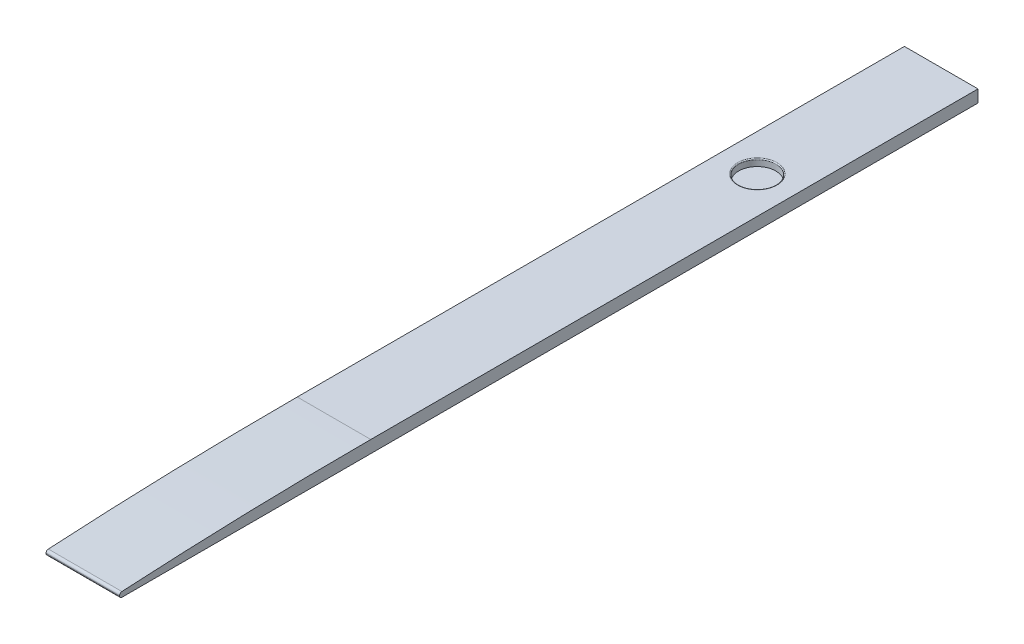
ISO-10303-21;
HEADER;
FILE_DESCRIPTION(('STEP AP214'),'2;1');
FILE_NAME('part.step','',(''),(''),'','','');
FILE_SCHEMA(('AUTOMOTIVE_DESIGN { 1 0 10303 214 1 1 1 1 }'));
ENDSEC;
DATA;
#1=APPLICATION_CONTEXT('core data for automotive mechanical design processes');
#2=APPLICATION_PROTOCOL_DEFINITION('international standard','automotive_design',2000,#1);
#3=PRODUCT_CONTEXT('',#1,'mechanical');
#4=PRODUCT('Part','Part','',(#3));
#5=PRODUCT_RELATED_PRODUCT_CATEGORY('part','',(#4));
#6=PRODUCT_DEFINITION_FORMATION('','',#4);
#7=PRODUCT_DEFINITION_CONTEXT('part definition',#1,'design');
#8=PRODUCT_DEFINITION('design','',#6,#7);
#9=PRODUCT_DEFINITION_SHAPE('','',#8);
#10=(LENGTH_UNIT() NAMED_UNIT(*) SI_UNIT(.MILLI.,.METRE.));
#11=(NAMED_UNIT(*) PLANE_ANGLE_UNIT() SI_UNIT($,.RADIAN.));
#12=(NAMED_UNIT(*) SI_UNIT($,.STERADIAN.) SOLID_ANGLE_UNIT());
#13=UNCERTAINTY_MEASURE_WITH_UNIT(LENGTH_MEASURE(1.E-05),#10,'distance_accuracy_value','');
#14=(GEOMETRIC_REPRESENTATION_CONTEXT(3) GLOBAL_UNCERTAINTY_ASSIGNED_CONTEXT((#13)) GLOBAL_UNIT_ASSIGNED_CONTEXT((#10,
#11,#12)) REPRESENTATION_CONTEXT('',''));
#15=CARTESIAN_POINT('',(0.,0.,0.));
#16=DIRECTION('',(0.,0.,1.));
#17=DIRECTION('',(1.,0.,0.));
#18=AXIS2_PLACEMENT_3D('',#15,#16,#17);
#19=CARTESIAN_POINT('',(30.,5.,0.));
#20=DIRECTION('',(0.,0.,1.));
#21=DIRECTION('',(0.,-1.,0.));
#22=AXIS2_PLACEMENT_3D('',#19,#20,#21);
#23=PLANE('',#22);
#24=DIRECTION('',(-1.,0.,0.));
#25=VECTOR('',#24,1.);
#26=CARTESIAN_POINT('',(25.,1.5,0.));
#27=LINE('',#26,#25);
#28=CARTESIAN_POINT('',(25.,1.5,0.));
#29=VERTEX_POINT('',#28);
#30=CARTESIAN_POINT('',(5.,1.5,0.));
#31=VERTEX_POINT('',#30);
#32=EDGE_CURVE('E157',#29,#31,#27,.T.);
#33=ORIENTED_EDGE('',*,*,#32,.F.);
#34=DIRECTION('',(0.,-1.,0.));
#35=VECTOR('',#34,1.);
#36=CARTESIAN_POINT('',(25.,3.5,0.));
#37=LINE('',#36,#35);
#38=CARTESIAN_POINT('',(25.,3.5,0.));
#39=VERTEX_POINT('',#38);
#40=EDGE_CURVE('E131',#39,#29,#37,.T.);
#41=ORIENTED_EDGE('',*,*,#40,.F.);
#42=DIRECTION('',(1.,0.,0.));
#43=VECTOR('',#42,1.);
#44=CARTESIAN_POINT('',(25.,3.5,0.));
#45=LINE('',#44,#43);
#46=CARTESIAN_POINT('',(5.,3.5,0.));
#47=VERTEX_POINT('',#46);
#48=EDGE_CURVE('E148',#47,#39,#45,.T.);
#49=ORIENTED_EDGE('',*,*,#48,.F.);
#50=DIRECTION('',(0.,1.,0.));
#51=VECTOR('',#50,1.);
#52=CARTESIAN_POINT('',(5.,3.5,0.));
#53=LINE('',#52,#51);
#54=EDGE_CURVE('E151',#31,#47,#53,.T.);
#55=ORIENTED_EDGE('',*,*,#54,.F.);
#56=EDGE_LOOP('',(#33,#41,#49,#55));
#57=FACE_BOUND('',#56,.T.);
#58=DIRECTION('',(0.,1.,0.));
#59=VECTOR('',#58,1.);
#60=CARTESIAN_POINT('',(0.,5.,0.));
#61=LINE('',#60,#59);
#62=CARTESIAN_POINT('',(0.,0.,0.));
#63=VERTEX_POINT('',#62);
#64=CARTESIAN_POINT('',(0.,5.,0.));
#65=VERTEX_POINT('',#64);
#66=EDGE_CURVE('E169',#63,#65,#61,.T.);
#67=ORIENTED_EDGE('',*,*,#66,.T.);
#68=DIRECTION('',(-1.,0.,0.));
#69=VECTOR('',#68,1.);
#70=CARTESIAN_POINT('',(30.,5.,0.));
#71=LINE('',#70,#69);
#72=CARTESIAN_POINT('',(30.,5.,0.));
#73=VERTEX_POINT('',#72);
#74=EDGE_CURVE('E192',#73,#65,#71,.T.);
#75=ORIENTED_EDGE('',*,*,#74,.F.);
#76=DIRECTION('',(0.,1.,0.));
#77=VECTOR('',#76,1.);
#78=CARTESIAN_POINT('',(30.,5.,0.));
#79=LINE('',#78,#77);
#80=CARTESIAN_POINT('',(30.,0.,0.));
#81=VERTEX_POINT('',#80);
#82=EDGE_CURVE('E170',#81,#73,#79,.T.);
#83=ORIENTED_EDGE('',*,*,#82,.F.);
#84=DIRECTION('',(-1.,0.,0.));
#85=VECTOR('',#84,1.);
#86=CARTESIAN_POINT('',(30.,0.,0.));
#87=LINE('',#86,#85);
#88=EDGE_CURVE('E181',#81,#63,#87,.T.);
#89=ORIENTED_EDGE('',*,*,#88,.T.);
#90=EDGE_LOOP('',(#67,#75,#83,#89));
#91=FACE_BOUND('',#90,.T.);
#92=ADVANCED_FACE('F39',(#57,#91),#23,.F.);
#93=CARTESIAN_POINT('',(30.,5.,300.));
#94=DIRECTION('',(0.,-1.,0.));
#95=DIRECTION('',(0.,0.,-1.));
#96=AXIS2_PLACEMENT_3D('',#93,#94,#95);
#97=PLANE('',#96);
#98=CARTESIAN_POINT('',(15.,5.,75.));
#99=DIRECTION('',(0.,-1.,0.));
#100=DIRECTION('',(0.,0.,-1.));
#101=AXIS2_PLACEMENT_3D('',#98,#99,#100);
#102=CIRCLE('',#101,8.);
#103=CARTESIAN_POINT('',(15.,5.,67.));
#104=VERTEX_POINT('',#103);
#105=EDGE_CURVE('E204',#104,#104,#102,.T.);
#106=ORIENTED_EDGE('',*,*,#105,.T.);
#107=EDGE_LOOP('',(#106));
#108=FACE_BOUND('',#107,.T.);
#109=DIRECTION('',(0.,0.,1.));
#110=VECTOR('',#109,1.);
#111=CARTESIAN_POINT('',(0.,5.,300.));
#112=LINE('',#111,#110);
#113=CARTESIAN_POINT('',(0.,5.,247.574417258189));
#114=VERTEX_POINT('',#113);
#115=EDGE_CURVE('E184',#65,#114,#112,.T.);
#116=ORIENTED_EDGE('',*,*,#115,.T.);
#117=DIRECTION('',(1.,0.,0.));
#118=VECTOR('',#117,1.);
#119=CARTESIAN_POINT('',(30.,5.,247.574417258189));
#120=LINE('',#119,#118);
#121=CARTESIAN_POINT('',(30.,4.99999999999989,247.574417258189));
#122=VERTEX_POINT('',#121);
#123=EDGE_CURVE('E197',#114,#122,#120,.T.);
#124=ORIENTED_EDGE('',*,*,#123,.T.);
#125=DIRECTION('',(0.,0.,1.));
#126=VECTOR('',#125,1.);
#127=CARTESIAN_POINT('',(30.,5.,300.));
#128=LINE('',#127,#126);
#129=EDGE_CURVE('E173',#73,#122,#128,.T.);
#130=ORIENTED_EDGE('',*,*,#129,.F.);
#131=ORIENTED_EDGE('',*,*,#74,.T.);
#132=EDGE_LOOP('',(#116,#124,#130,#131));
#133=FACE_BOUND('',#132,.T.);
#134=ADVANCED_FACE('F242',(#108,#133),#97,.F.);
#135=CARTESIAN_POINT('',(30.,0.,350.));
#136=DIRECTION('',(0.,0.,-1.));
#137=DIRECTION('',(-1.,0.,0.));
#138=AXIS2_PLACEMENT_3D('',#135,#136,#137);
#139=PLANE('',#138);
#140=DIRECTION('',(0.,-1.,0.));
#141=VECTOR('',#140,1.);
#142=CARTESIAN_POINT('',(0.,0.,350.));
#143=LINE('',#142,#141);
#144=CARTESIAN_POINT('',(0.,1.05665749009543,350.));
#145=VERTEX_POINT('',#144);
#146=CARTESIAN_POINT('',(0.,0.999999999999957,350.));
#147=VERTEX_POINT('',#146);
#148=EDGE_CURVE('E187',#145,#147,#143,.T.);
#149=ORIENTED_EDGE('',*,*,#148,.T.);
#150=DIRECTION('',(-1.,0.,0.));
#151=VECTOR('',#150,1.);
#152=CARTESIAN_POINT('',(30.,0.999999999999957,350.));
#153=LINE('',#152,#151);
#154=CARTESIAN_POINT('',(30.,0.999999999999957,350.));
#155=VERTEX_POINT('',#154);
#156=EDGE_CURVE('E60',#147,#155,#153,.F.);
#157=ORIENTED_EDGE('',*,*,#156,.T.);
#158=DIRECTION('',(0.,-1.,0.));
#159=VECTOR('',#158,1.);
#160=CARTESIAN_POINT('',(30.,0.,350.));
#161=LINE('',#160,#159);
#162=CARTESIAN_POINT('',(30.,1.05665749009543,350.));
#163=VERTEX_POINT('',#162);
#164=EDGE_CURVE('E177',#163,#155,#161,.T.);
#165=ORIENTED_EDGE('',*,*,#164,.F.);
#166=DIRECTION('',(-1.,0.,0.));
#167=VECTOR('',#166,1.);
#168=CARTESIAN_POINT('',(0.,1.05665749009543,350.));
#169=LINE('',#168,#167);
#170=EDGE_CURVE('E214',#163,#145,#169,.T.);
#171=ORIENTED_EDGE('',*,*,#170,.T.);
#172=EDGE_LOOP('',(#149,#157,#165,#171));
#173=FACE_BOUND('',#172,.T.);
#174=ADVANCED_FACE('F235',(#173),#139,.F.);
#175=CARTESIAN_POINT('',(30.,0.,0.));
#176=DIRECTION('',(0.,1.,0.));
#177=DIRECTION('',(0.,0.,1.));
#178=AXIS2_PLACEMENT_3D('',#175,#176,#177);
#179=PLANE('',#178);
#180=DIRECTION('',(0.,0.,-1.));
#181=VECTOR('',#180,1.);
#182=CARTESIAN_POINT('',(30.,0.,0.));
#183=LINE('',#182,#181);
#184=CARTESIAN_POINT('',(30.,0.,349.));
#185=VERTEX_POINT('',#184);
#186=EDGE_CURVE('E179',#185,#81,#183,.T.);
#187=ORIENTED_EDGE('',*,*,#186,.F.);
#188=DIRECTION('',(-1.,0.,0.));
#189=VECTOR('',#188,1.);
#190=CARTESIAN_POINT('',(30.,0.,349.));
#191=LINE('',#190,#189);
#192=CARTESIAN_POINT('',(0.,0.,349.));
#193=VERTEX_POINT('',#192);
#194=EDGE_CURVE('E207',#185,#193,#191,.T.);
#195=ORIENTED_EDGE('',*,*,#194,.T.);
#196=DIRECTION('',(0.,0.,-1.));
#197=VECTOR('',#196,1.);
#198=CARTESIAN_POINT('',(0.,0.,0.));
#199=LINE('',#198,#197);
#200=EDGE_CURVE('E174',#193,#63,#199,.T.);
#201=ORIENTED_EDGE('',*,*,#200,.T.);
#202=ORIENTED_EDGE('',*,*,#88,.F.);
#203=EDGE_LOOP('',(#187,#195,#201,#202));
#204=FACE_BOUND('',#203,.T.);
#205=ADVANCED_FACE('F227',(#204),#179,.F.);
#206=CARTESIAN_POINT('',(30.,0.,0.));
#207=DIRECTION('',(-1.,0.,0.));
#208=DIRECTION('',(0.,0.,1.));
#209=AXIS2_PLACEMENT_3D('',#206,#207,#208);
#210=PLANE('',#209);
#211=ORIENTED_EDGE('',*,*,#164,.T.);
#212=CARTESIAN_POINT('',(30.,0.999999999999957,349.));
#213=DIRECTION('',(-1.,0.,0.));
#214=DIRECTION('',(0.,0.,1.));
#215=AXIS2_PLACEMENT_3D('',#212,#213,#214);
#216=CIRCLE('',#215,1.);
#217=EDGE_CURVE('E47',#155,#185,#216,.F.);
#218=ORIENTED_EDGE('',*,*,#217,.T.);
#219=ORIENTED_EDGE('',*,*,#186,.T.);
#220=ORIENTED_EDGE('',*,*,#82,.T.);
#221=ORIENTED_EDGE('',*,*,#129,.T.);
#222=CARTESIAN_POINT('',(30.,-1745.,247.574417258189));
#223=DIRECTION('',(-1.,0.,0.));
#224=DIRECTION('',(0.,0.,1.));
#225=AXIS2_PLACEMENT_3D('',#222,#223,#224);
#226=CIRCLE('',#225,1750.);
#227=CARTESIAN_POINT('',(30.,2.05497461844861,349.057990613346));
#228=VERTEX_POINT('',#227);
#229=EDGE_CURVE('E199',#122,#228,#226,.F.);
#230=ORIENTED_EDGE('',*,*,#229,.T.);
#231=CARTESIAN_POINT('',(30.,1.05665749009543,349.));
#232=DIRECTION('',(-1.,0.,0.));
#233=DIRECTION('',(0.,0.,1.));
#234=AXIS2_PLACEMENT_3D('',#231,#232,#233);
#235=CIRCLE('',#234,1.);
#236=EDGE_CURVE('E218',#228,#163,#235,.F.);
#237=ORIENTED_EDGE('',*,*,#236,.T.);
#238=EDGE_LOOP('',(#211,#218,#219,#220,#221,#230,#237));
#239=FACE_BOUND('',#238,.T.);
#240=ADVANCED_FACE('F222',(#239),#210,.F.);
#241=CARTESIAN_POINT('',(0.,0.,0.));
#242=DIRECTION('',(-1.,0.,0.));
#243=DIRECTION('',(0.,0.,1.));
#244=AXIS2_PLACEMENT_3D('',#241,#242,#243);
#245=PLANE('',#244);
#246=ORIENTED_EDGE('',*,*,#200,.F.);
#247=CARTESIAN_POINT('',(0.,0.999999999999957,349.));
#248=DIRECTION('',(-1.,0.,0.));
#249=DIRECTION('',(0.,0.,1.));
#250=AXIS2_PLACEMENT_3D('',#247,#248,#249);
#251=CIRCLE('',#250,1.);
#252=EDGE_CURVE('E212',#193,#147,#251,.T.);
#253=ORIENTED_EDGE('',*,*,#252,.T.);
#254=ORIENTED_EDGE('',*,*,#148,.F.);
#255=CARTESIAN_POINT('',(0.,1.05665749009543,349.));
#256=DIRECTION('',(-1.,0.,0.));
#257=DIRECTION('',(0.,0.,1.));
#258=AXIS2_PLACEMENT_3D('',#255,#256,#257);
#259=CIRCLE('',#258,1.);
#260=CARTESIAN_POINT('',(0.,2.05497461844861,349.057990613346));
#261=VERTEX_POINT('',#260);
#262=EDGE_CURVE('E210',#145,#261,#259,.T.);
#263=ORIENTED_EDGE('',*,*,#262,.T.);
#264=CARTESIAN_POINT('',(0.,-1745.,247.574417258189));
#265=DIRECTION('',(-1.,0.,0.));
#266=DIRECTION('',(0.,0.,1.));
#267=AXIS2_PLACEMENT_3D('',#264,#265,#266);
#268=CIRCLE('',#267,1750.);
#269=EDGE_CURVE('E195',#261,#114,#268,.T.);
#270=ORIENTED_EDGE('',*,*,#269,.T.);
#271=ORIENTED_EDGE('',*,*,#115,.F.);
#272=ORIENTED_EDGE('',*,*,#66,.F.);
#273=EDGE_LOOP('',(#246,#253,#254,#263,#270,#271,#272));
#274=FACE_BOUND('',#273,.T.);
#275=ADVANCED_FACE('F233',(#274),#245,.T.);
#276=CARTESIAN_POINT('',(30.,-1745.,247.574417258189));
#277=DIRECTION('',(1.,0.,0.));
#278=DIRECTION('',(0.,0.,-1.));
#279=AXIS2_PLACEMENT_3D('',#276,#277,#278);
#280=CYLINDRICAL_SURFACE('',#279,1750.);
#281=ORIENTED_EDGE('',*,*,#269,.F.);
#282=DIRECTION('',(1.,0.,0.));
#283=VECTOR('',#282,1.);
#284=CARTESIAN_POINT('',(30.,2.05497461844883,349.057990613346));
#285=LINE('',#284,#283);
#286=EDGE_CURVE('E11',#261,#228,#285,.T.);
#287=ORIENTED_EDGE('',*,*,#286,.T.);
#288=ORIENTED_EDGE('',*,*,#229,.F.);
#289=ORIENTED_EDGE('',*,*,#123,.F.);
#290=EDGE_LOOP('',(#281,#287,#288,#289));
#291=FACE_BOUND('',#290,.T.);
#292=ADVANCED_FACE('F240',(#291),#280,.T.);
#293=CARTESIAN_POINT('',(15.,2.2,75.));
#294=DIRECTION('',(0.,1.,0.));
#295=DIRECTION('',(0.,0.,1.));
#296=AXIS2_PLACEMENT_3D('',#293,#294,#295);
#297=CYLINDRICAL_SURFACE('',#296,7.6);
#298=CARTESIAN_POINT('',(15.,4.6,75.));
#299=DIRECTION('',(0.,-1.,0.));
#300=DIRECTION('',(0.,0.,-1.));
#301=AXIS2_PLACEMENT_3D('',#298,#299,#300);
#302=CIRCLE('',#301,7.6);
#303=CARTESIAN_POINT('',(15.,4.6,67.4));
#304=VERTEX_POINT('',#303);
#305=EDGE_CURVE('E201',#304,#304,#302,.F.);
#306=ORIENTED_EDGE('',*,*,#305,.T.);
#307=EDGE_LOOP('',(#306));
#308=FACE_BOUND('',#307,.T.);
#309=CARTESIAN_POINT('',(15.,2.2,75.));
#310=DIRECTION('',(0.,1.,0.));
#311=DIRECTION('',(0.,0.,1.));
#312=AXIS2_PLACEMENT_3D('',#309,#310,#311);
#313=CIRCLE('',#312,7.6);
#314=CARTESIAN_POINT('',(15.,2.2,82.6));
#315=VERTEX_POINT('',#314);
#316=EDGE_CURVE('E163',#315,#315,#313,.T.);
#317=ORIENTED_EDGE('',*,*,#316,.F.);
#318=EDGE_LOOP('',(#317));
#319=FACE_BOUND('',#318,.T.);
#320=ADVANCED_FACE('F257',(#308,#319),#297,.F.);
#321=CARTESIAN_POINT('',(15.,2.2,75.));
#322=DIRECTION('',(0.,1.,0.));
#323=DIRECTION('',(0.,0.,1.));
#324=AXIS2_PLACEMENT_3D('',#321,#322,#323);
#325=PLANE('',#324);
#326=ORIENTED_EDGE('',*,*,#316,.T.);
#327=EDGE_LOOP('',(#326));
#328=FACE_BOUND('',#327,.T.);
#329=ADVANCED_FACE('F260',(#328),#325,.T.);
#330=CARTESIAN_POINT('',(15.,4.6,75.));
#331=DIRECTION('',(0.,-1.,0.));
#332=DIRECTION('',(0.,0.,-1.));
#333=AXIS2_PLACEMENT_3D('',#330,#331,#332);
#334=TOROIDAL_SURFACE('',#333,8.,0.4);
#335=ORIENTED_EDGE('',*,*,#105,.F.);
#336=EDGE_LOOP('',(#335));
#337=FACE_BOUND('',#336,.T.);
#338=ORIENTED_EDGE('',*,*,#305,.F.);
#339=EDGE_LOOP('',(#338));
#340=FACE_BOUND('',#339,.T.);
#341=ADVANCED_FACE('F258',(#337,#340),#334,.T.);
#342=CARTESIAN_POINT('',(25.,3.5,25.));
#343=DIRECTION('',(1.,0.,0.));
#344=DIRECTION('',(0.,0.,-1.));
#345=AXIS2_PLACEMENT_3D('',#342,#343,#344);
#346=PLANE('',#345);
#347=ORIENTED_EDGE('',*,*,#40,.T.);
#348=DIRECTION('',(0.,0.,-1.));
#349=VECTOR('',#348,1.);
#350=CARTESIAN_POINT('',(25.,1.5,25.));
#351=LINE('',#350,#349);
#352=CARTESIAN_POINT('',(25.,1.5,25.));
#353=VERTEX_POINT('',#352);
#354=EDGE_CURVE('E124',#353,#29,#351,.T.);
#355=ORIENTED_EDGE('',*,*,#354,.F.);
#356=DIRECTION('',(0.,-1.,0.));
#357=VECTOR('',#356,1.);
#358=CARTESIAN_POINT('',(25.,3.5,25.));
#359=LINE('',#358,#357);
#360=CARTESIAN_POINT('',(25.,3.5,25.));
#361=VERTEX_POINT('',#360);
#362=EDGE_CURVE('E128',#361,#353,#359,.T.);
#363=ORIENTED_EDGE('',*,*,#362,.F.);
#364=DIRECTION('',(0.,0.,-1.));
#365=VECTOR('',#364,1.);
#366=CARTESIAN_POINT('',(25.,3.5,25.));
#367=LINE('',#366,#365);
#368=EDGE_CURVE('E161',#361,#39,#367,.T.);
#369=ORIENTED_EDGE('',*,*,#368,.T.);
#370=EDGE_LOOP('',(#347,#355,#363,#369));
#371=FACE_BOUND('',#370,.T.);
#372=ADVANCED_FACE('F126',(#371),#346,.F.);
#373=CARTESIAN_POINT('',(25.,3.5,25.));
#374=DIRECTION('',(0.,1.,0.));
#375=DIRECTION('',(0.,0.,1.));
#376=AXIS2_PLACEMENT_3D('',#373,#374,#375);
#377=PLANE('',#376);
#378=ORIENTED_EDGE('',*,*,#48,.T.);
#379=ORIENTED_EDGE('',*,*,#368,.F.);
#380=DIRECTION('',(1.,0.,0.));
#381=VECTOR('',#380,1.);
#382=CARTESIAN_POINT('',(25.,3.5,25.));
#383=LINE('',#382,#381);
#384=CARTESIAN_POINT('',(5.,3.5,25.));
#385=VERTEX_POINT('',#384);
#386=EDGE_CURVE('E136',#385,#361,#383,.T.);
#387=ORIENTED_EDGE('',*,*,#386,.F.);
#388=DIRECTION('',(0.,0.,-1.));
#389=VECTOR('',#388,1.);
#390=CARTESIAN_POINT('',(5.,3.5,25.));
#391=LINE('',#390,#389);
#392=EDGE_CURVE('E164',#385,#47,#391,.T.);
#393=ORIENTED_EDGE('',*,*,#392,.T.);
#394=EDGE_LOOP('',(#378,#379,#387,#393));
#395=FACE_BOUND('',#394,.T.);
#396=ADVANCED_FACE('F274',(#395),#377,.F.);
#397=CARTESIAN_POINT('',(5.,3.5,25.));
#398=DIRECTION('',(-1.,0.,0.));
#399=DIRECTION('',(0.,0.,1.));
#400=AXIS2_PLACEMENT_3D('',#397,#398,#399);
#401=PLANE('',#400);
#402=ORIENTED_EDGE('',*,*,#54,.T.);
#403=ORIENTED_EDGE('',*,*,#392,.F.);
#404=DIRECTION('',(0.,1.,0.));
#405=VECTOR('',#404,1.);
#406=CARTESIAN_POINT('',(5.,3.5,25.));
#407=LINE('',#406,#405);
#408=CARTESIAN_POINT('',(5.,1.5,25.));
#409=VERTEX_POINT('',#408);
#410=EDGE_CURVE('E144',#409,#385,#407,.T.);
#411=ORIENTED_EDGE('',*,*,#410,.F.);
#412=DIRECTION('',(0.,0.,-1.));
#413=VECTOR('',#412,1.);
#414=CARTESIAN_POINT('',(5.,1.5,25.));
#415=LINE('',#414,#413);
#416=EDGE_CURVE('E135',#409,#31,#415,.T.);
#417=ORIENTED_EDGE('',*,*,#416,.T.);
#418=EDGE_LOOP('',(#402,#403,#411,#417));
#419=FACE_BOUND('',#418,.T.);
#420=ADVANCED_FACE('F271',(#419),#401,.F.);
#421=CARTESIAN_POINT('',(25.,1.5,25.));
#422=DIRECTION('',(0.,-1.,0.));
#423=DIRECTION('',(0.,0.,-1.));
#424=AXIS2_PLACEMENT_3D('',#421,#422,#423);
#425=PLANE('',#424);
#426=ORIENTED_EDGE('',*,*,#32,.T.);
#427=ORIENTED_EDGE('',*,*,#416,.F.);
#428=DIRECTION('',(-1.,0.,0.));
#429=VECTOR('',#428,1.);
#430=CARTESIAN_POINT('',(25.,1.5,25.));
#431=LINE('',#430,#429);
#432=EDGE_CURVE('E139',#353,#409,#431,.T.);
#433=ORIENTED_EDGE('',*,*,#432,.F.);
#434=ORIENTED_EDGE('',*,*,#354,.T.);
#435=EDGE_LOOP('',(#426,#427,#433,#434));
#436=FACE_BOUND('',#435,.T.);
#437=ADVANCED_FACE('F140',(#436),#425,.F.);
#438=CARTESIAN_POINT('',(0.,0.,25.));
#439=DIRECTION('',(0.,0.,-1.));
#440=DIRECTION('',(0.,1.,0.));
#441=AXIS2_PLACEMENT_3D('',#438,#439,#440);
#442=PLANE('',#441);
#443=ORIENTED_EDGE('',*,*,#362,.T.);
#444=ORIENTED_EDGE('',*,*,#432,.T.);
#445=ORIENTED_EDGE('',*,*,#410,.T.);
#446=ORIENTED_EDGE('',*,*,#386,.T.);
#447=EDGE_LOOP('',(#443,#444,#445,#446));
#448=FACE_BOUND('',#447,.T.);
#449=ADVANCED_FACE('F146',(#448),#442,.T.);
#450=CARTESIAN_POINT('',(30.,0.999999999999957,349.));
#451=DIRECTION('',(-1.,0.,0.));
#452=DIRECTION('',(0.,0.,1.));
#453=AXIS2_PLACEMENT_3D('',#450,#451,#452);
#454=CYLINDRICAL_SURFACE('',#453,1.);
#455=ORIENTED_EDGE('',*,*,#217,.F.);
#456=ORIENTED_EDGE('',*,*,#156,.F.);
#457=ORIENTED_EDGE('',*,*,#252,.F.);
#458=ORIENTED_EDGE('',*,*,#194,.F.);
#459=EDGE_LOOP('',(#455,#456,#457,#458));
#460=FACE_BOUND('',#459,.T.);
#461=ADVANCED_FACE('F230',(#460),#454,.T.);
#462=CARTESIAN_POINT('',(30.,1.05665749009543,349.));
#463=DIRECTION('',(1.,0.,0.));
#464=DIRECTION('',(0.,0.,-1.));
#465=AXIS2_PLACEMENT_3D('',#462,#463,#464);
#466=CYLINDRICAL_SURFACE('',#465,1.);
#467=ORIENTED_EDGE('',*,*,#236,.F.);
#468=ORIENTED_EDGE('',*,*,#286,.F.);
#469=ORIENTED_EDGE('',*,*,#262,.F.);
#470=ORIENTED_EDGE('',*,*,#170,.F.);
#471=EDGE_LOOP('',(#467,#468,#469,#470));
#472=FACE_BOUND('',#471,.T.);
#473=ADVANCED_FACE('F41',(#472),#466,.T.);
#474=CLOSED_SHELL('',(#92,#134,#174,#205,#240,#275,#292,#320,#329,#341,#372,#396,#420,#437,#449,
#461,#473));
#475=MANIFOLD_SOLID_BREP('B2',#474);
#476=ADVANCED_BREP_SHAPE_REPRESENTATION('',(#18,#475),#14);
#477=SHAPE_DEFINITION_REPRESENTATION(#9,#476);
ENDSEC;
END-ISO-10303-21;
